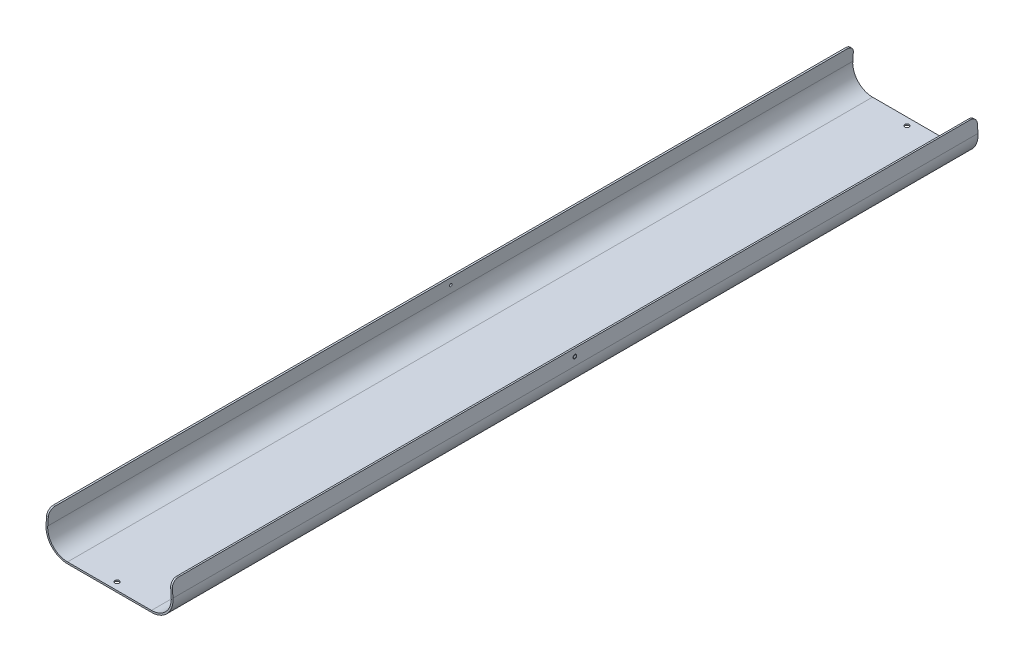
ISO-10303-21;
HEADER;
FILE_DESCRIPTION(('STEP AP214'),'2;1');
FILE_NAME('part.step','',(''),(''),'','','');
FILE_SCHEMA(('AUTOMOTIVE_DESIGN { 1 0 10303 214 1 1 1 1 }'));
ENDSEC;
DATA;
#1=APPLICATION_CONTEXT('core data for automotive mechanical design processes');
#2=APPLICATION_PROTOCOL_DEFINITION('international standard','automotive_design',2000,#1);
#3=PRODUCT_CONTEXT('',#1,'mechanical');
#4=PRODUCT('Part','Part','',(#3));
#5=PRODUCT_RELATED_PRODUCT_CATEGORY('part','',(#4));
#6=PRODUCT_DEFINITION_FORMATION('','',#4);
#7=PRODUCT_DEFINITION_CONTEXT('part definition',#1,'design');
#8=PRODUCT_DEFINITION('design','',#6,#7);
#9=PRODUCT_DEFINITION_SHAPE('','',#8);
#10=(LENGTH_UNIT() NAMED_UNIT(*) SI_UNIT(.MILLI.,.METRE.));
#11=(NAMED_UNIT(*) PLANE_ANGLE_UNIT() SI_UNIT($,.RADIAN.));
#12=(NAMED_UNIT(*) SI_UNIT($,.STERADIAN.) SOLID_ANGLE_UNIT());
#13=UNCERTAINTY_MEASURE_WITH_UNIT(LENGTH_MEASURE(1.E-05),#10,'distance_accuracy_value','');
#14=(GEOMETRIC_REPRESENTATION_CONTEXT(3) GLOBAL_UNCERTAINTY_ASSIGNED_CONTEXT((#13)) GLOBAL_UNIT_ASSIGNED_CONTEXT((#10,
#11,#12)) REPRESENTATION_CONTEXT('',''));
#15=CARTESIAN_POINT('',(0.,0.,0.));
#16=DIRECTION('',(0.,0.,1.));
#17=DIRECTION('',(1.,0.,0.));
#18=AXIS2_PLACEMENT_3D('',#15,#16,#17);
#19=CARTESIAN_POINT('',(534.973263073257,-183.689342682324,-133.95));
#20=DIRECTION('',(0.997564050259824,0.0697564737441253,0.));
#21=DIRECTION('',(-0.0697564737441253,0.997564050259824,0.));
#22=AXIS2_PLACEMENT_3D('',#19,#20,#21);
#23=CYLINDRICAL_SURFACE('',#22,1.25);
#24=CARTESIAN_POINT('',(533.377160592841,-183.800953040315,-133.95));
#25=DIRECTION('',(0.997564050259824,0.0697564737441253,0.));
#26=DIRECTION('',(-0.0697564737441253,0.997564050259824,0.));
#27=AXIS2_PLACEMENT_3D('',#24,#25,#26);
#28=CIRCLE('',#27,1.25);
#29=CARTESIAN_POINT('',(533.289965000661,-182.55399797749,-133.95));
#30=VERTEX_POINT('',#29);
#31=EDGE_CURVE('E264',#30,#30,#28,.F.);
#32=ORIENTED_EDGE('',*,*,#31,.T.);
#33=EDGE_LOOP('',(#32));
#34=FACE_BOUND('',#33,.T.);
#35=CARTESIAN_POINT('',(534.714088330439,-183.707465945825,-133.95));
#36=DIRECTION('',(0.997564050259825,0.0697564737441149,0.));
#37=DIRECTION('',(-0.0697564737440851,0.997564050259827,0.));
#38=AXIS2_PLACEMENT_3D('',#35,#36,#37);
#39=CIRCLE('',#38,1.24999999999625);
#40=CARTESIAN_POINT('',(534.62689273826,-182.460510883004,-133.95));
#41=VERTEX_POINT('',#40);
#42=EDGE_CURVE('E135',#41,#41,#39,.T.);
#43=ORIENTED_EDGE('',*,*,#42,.T.);
#44=EDGE_LOOP('',(#43));
#45=FACE_BOUND('',#44,.T.);
#46=ADVANCED_FACE('F16',(#34,#45),#23,.F.);
#47=CARTESIAN_POINT('',(418.043090655977,-183.76014596377,-133.95));
#48=DIRECTION('',(-0.997564050259822,0.069756473744153,0.));
#49=DIRECTION('',(-0.069756473744153,-0.997564050259822,0.));
#50=AXIS2_PLACEMENT_3D('',#47,#48,#49);
#51=CONICAL_SURFACE('',#50,1.6999999999747,1.04719755117636);
#52=CARTESIAN_POINT('',(418.043090656017,-183.760145963773,-133.95));
#53=DIRECTION('',(-0.997564050259822,0.069756473744153,0.));
#54=DIRECTION('',(-0.069756473744153,-0.997564050259822,0.));
#55=AXIS2_PLACEMENT_3D('',#52,#53,#54);
#56=CIRCLE('',#55,1.69999999990524);
#57=CARTESIAN_POINT('',(417.924504650659,-185.45600484912,-133.95));
#58=VERTEX_POINT('',#57);
#59=EDGE_CURVE('E261',#58,#58,#56,.F.);
#60=ORIENTED_EDGE('',*,*,#59,.F.);
#61=EDGE_LOOP('',(#60));
#62=FACE_BOUND('',#61,.T.);
#63=CARTESIAN_POINT('',(418.302265398848,-183.778269227275,-133.95));
#64=DIRECTION('',(-0.997564050259824,0.0697564737441253,0.));
#65=DIRECTION('',(-0.0697564737441253,-0.997564050259824,0.));
#66=AXIS2_PLACEMENT_3D('',#63,#64,#65);
#67=CIRCLE('',#66,1.25);
#68=CARTESIAN_POINT('',(418.215069806668,-185.0252242901,-133.95));
#69=VERTEX_POINT('',#68);
#70=EDGE_CURVE('E147',#69,#69,#67,.F.);
#71=ORIENTED_EDGE('',*,*,#70,.T.);
#72=EDGE_LOOP('',(#71));
#73=FACE_BOUND('',#72,.T.);
#74=ADVANCED_FACE('F539',(#62,#73),#51,.F.);
#75=CARTESIAN_POINT('',(534.973263073267,-183.689342682323,-133.95));
#76=DIRECTION('',(0.997564050259826,0.0697564737440966,0.));
#77=DIRECTION('',(-0.0697564737440966,0.997564050259826,0.));
#78=AXIS2_PLACEMENT_3D('',#75,#76,#77);
#79=CONICAL_SURFACE('',#78,1.70000000006523,1.04719755121284);
#80=CARTESIAN_POINT('',(534.973263073306,-183.68934268232,-133.95));
#81=DIRECTION('',(0.997564050259826,0.0697564737440966,0.));
#82=DIRECTION('',(-0.0697564737440966,0.997564050259826,0.));
#83=AXIS2_PLACEMENT_3D('',#80,#81,#82);
#84=CIRCLE('',#83,1.70000000013203);
#85=CARTESIAN_POINT('',(534.854677067932,-181.993483796747,-133.95));
#86=VERTEX_POINT('',#85);
#87=EDGE_CURVE('E184',#86,#86,#84,.F.);
#88=ORIENTED_EDGE('',*,*,#87,.F.);
#89=EDGE_LOOP('',(#88));
#90=FACE_BOUND('',#89,.T.);
#91=ORIENTED_EDGE('',*,*,#42,.F.);
#92=EDGE_LOOP('',(#91));
#93=FACE_BOUND('',#92,.T.);
#94=ADVANCED_FACE('F531',(#90,#93),#79,.F.);
#95=CARTESIAN_POINT('',(452.110985161686,-189.113817252795,-501.95));
#96=DIRECTION('',(-0.997564050259824,-0.0697564737441253,0.));
#97=DIRECTION('',(0.0697564737441253,-0.997564050259824,0.));
#98=AXIS2_PLACEMENT_3D('',#95,#96,#97);
#99=CYLINDRICAL_SURFACE('',#98,6.);
#100=DIRECTION('',(-0.997564050259824,-0.0697564737441253,0.));
#101=VECTOR('',#100,1.);
#102=CARTESIAN_POINT('',(452.110985161686,-189.113817252795,-507.95));
#103=LINE('',#102,#101);
#104=CARTESIAN_POINT('',(534.947528550506,-183.321321861195,-507.95));
#105=VERTEX_POINT('',#104);
#106=CARTESIAN_POINT('',(533.351426070091,-183.432932219185,-507.95));
#107=VERTEX_POINT('',#106);
#108=EDGE_CURVE('E125',#105,#107,#103,.T.);
#109=ORIENTED_EDGE('',*,*,#108,.T.);
#110=CARTESIAN_POINT('',(533.351426070091,-183.432932219185,-501.95));
#111=DIRECTION('',(-0.997564050259824,-0.0697564737441253,0.));
#112=DIRECTION('',(0.0697564737441253,-0.997564050259824,0.));
#113=AXIS2_PLACEMENT_3D('',#110,#111,#112);
#114=CIRCLE('',#113,6.);
#115=CARTESIAN_POINT('',(532.932887227626,-177.447547917626,-501.95));
#116=VERTEX_POINT('',#115);
#117=EDGE_CURVE('E19',#107,#116,#114,.F.);
#118=ORIENTED_EDGE('',*,*,#117,.T.);
#119=DIRECTION('',(-0.997564050259824,-0.0697564737441253,0.));
#120=VECTOR('',#119,1.);
#121=CARTESIAN_POINT('',(532.932887227626,-177.447547917626,-501.95));
#122=LINE('',#121,#120);
#123=CARTESIAN_POINT('',(534.528989708042,-177.335937559636,-501.95));
#124=VERTEX_POINT('',#123);
#125=EDGE_CURVE('E134',#124,#116,#122,.T.);
#126=ORIENTED_EDGE('',*,*,#125,.F.);
#127=CARTESIAN_POINT('',(534.947528550507,-183.321321861194,-501.95));
#128=DIRECTION('',(-0.997564050259824,-0.0697564737441253,0.));
#129=DIRECTION('',(0.0697564737441253,-0.997564050259824,0.));
#130=AXIS2_PLACEMENT_3D('',#127,#128,#129);
#131=CIRCLE('',#130,6.);
#132=EDGE_CURVE('E129',#105,#124,#131,.F.);
#133=ORIENTED_EDGE('',*,*,#132,.F.);
#134=EDGE_LOOP('',(#109,#118,#126,#133));
#135=FACE_BOUND('',#134,.T.);
#136=ADVANCED_FACE('F127',(#135),#99,.T.);
#137=CARTESIAN_POINT('',(532.932887227626,-177.447547917626,243.05));
#138=DIRECTION('',(-0.0697564737441253,0.997564050259824,0.));
#139=DIRECTION('',(-0.997564050259824,-0.0697564737441253,0.));
#140=AXIS2_PLACEMENT_3D('',#137,#138,#139);
#141=PLANE('',#140);
#142=DIRECTION('',(-0.997564050259824,-0.0697564737441253,0.));
#143=VECTOR('',#142,1.);
#144=CARTESIAN_POINT('',(451.692446319221,-183.128432951236,234.05));
#145=LINE('',#144,#143);
#146=CARTESIAN_POINT('',(534.528989708041,-177.335937559636,234.05));
#147=VERTEX_POINT('',#146);
#148=CARTESIAN_POINT('',(532.932887227626,-177.447547917626,234.05));
#149=VERTEX_POINT('',#148);
#150=EDGE_CURVE('E208',#147,#149,#145,.T.);
#151=ORIENTED_EDGE('',*,*,#150,.F.);
#152=DIRECTION('',(0.,0.,1.));
#153=VECTOR('',#152,1.);
#154=CARTESIAN_POINT('',(534.528989708041,-177.335937559636,-133.95));
#155=LINE('',#154,#153);
#156=EDGE_CURVE('E179',#124,#147,#155,.T.);
#157=ORIENTED_EDGE('',*,*,#156,.F.);
#158=ORIENTED_EDGE('',*,*,#125,.T.);
#159=DIRECTION('',(0.,0.,1.));
#160=VECTOR('',#159,1.);
#161=CARTESIAN_POINT('',(532.932887227626,-177.447547917626,-133.95));
#162=LINE('',#161,#160);
#163=EDGE_CURVE('E146',#116,#149,#162,.T.);
#164=ORIENTED_EDGE('',*,*,#163,.T.);
#165=EDGE_LOOP('',(#151,#157,#158,#164));
#166=FACE_BOUND('',#165,.T.);
#167=ADVANCED_FACE('F515',(#166),#141,.T.);
#168=CARTESIAN_POINT('',(452.110985161686,-189.113817252795,234.05));
#169=DIRECTION('',(-0.997564050259824,-0.0697564737441253,0.));
#170=DIRECTION('',(0.0697564737441253,-0.997564050259824,0.));
#171=AXIS2_PLACEMENT_3D('',#168,#169,#170);
#172=CYLINDRICAL_SURFACE('',#171,6.);
#173=ORIENTED_EDGE('',*,*,#150,.T.);
#174=CARTESIAN_POINT('',(533.351426070091,-183.432932219185,234.05));
#175=DIRECTION('',(-0.997564050259824,-0.0697564737441253,0.));
#176=DIRECTION('',(0.0697564737441253,-0.997564050259824,0.));
#177=AXIS2_PLACEMENT_3D('',#174,#175,#176);
#178=CIRCLE('',#177,6.);
#179=CARTESIAN_POINT('',(533.351426070091,-183.432932219185,240.05));
#180=VERTEX_POINT('',#179);
#181=EDGE_CURVE('E199',#149,#180,#178,.F.);
#182=ORIENTED_EDGE('',*,*,#181,.T.);
#183=DIRECTION('',(-0.997564050259824,-0.0697564737441253,0.));
#184=VECTOR('',#183,1.);
#185=CARTESIAN_POINT('',(452.110985161686,-189.113817252795,240.05));
#186=LINE('',#185,#184);
#187=CARTESIAN_POINT('',(534.947528550506,-183.321321861194,240.05));
#188=VERTEX_POINT('',#187);
#189=EDGE_CURVE('E209',#180,#188,#186,.F.);
#190=ORIENTED_EDGE('',*,*,#189,.T.);
#191=CARTESIAN_POINT('',(534.947528550506,-183.321321861195,234.05));
#192=DIRECTION('',(-0.997564050259824,-0.0697564737441253,0.));
#193=DIRECTION('',(0.0697564737441253,-0.997564050259824,0.));
#194=AXIS2_PLACEMENT_3D('',#191,#192,#193);
#195=CIRCLE('',#194,6.);
#196=EDGE_CURVE('E181',#147,#188,#195,.F.);
#197=ORIENTED_EDGE('',*,*,#196,.F.);
#198=EDGE_LOOP('',(#173,#182,#190,#197));
#199=FACE_BOUND('',#198,.T.);
#200=ADVANCED_FACE('F268',(#199),#172,.T.);
#201=CARTESIAN_POINT('',(452.110985161686,-185.701435369486,234.05));
#202=DIRECTION('',(0.997564050259824,-0.0697564737441253,0.));
#203=DIRECTION('',(0.0697564737441253,0.997564050259824,0.));
#204=AXIS2_PLACEMENT_3D('',#201,#202,#203);
#205=CYLINDRICAL_SURFACE('',#204,6.);
#206=DIRECTION('',(0.997564050259824,-0.0697564737441253,0.));
#207=VECTOR('',#206,1.);
#208=CARTESIAN_POINT('',(452.110985161686,-185.701435369487,240.05));
#209=LINE('',#208,#207);
#210=CARTESIAN_POINT('',(418.073776226517,-183.321321861195,240.05));
#211=VERTEX_POINT('',#210);
#212=CARTESIAN_POINT('',(419.669878706933,-183.432932219185,240.05));
#213=VERTEX_POINT('',#212);
#214=EDGE_CURVE('E206',#211,#213,#209,.T.);
#215=ORIENTED_EDGE('',*,*,#214,.T.);
#216=CARTESIAN_POINT('',(419.669878706933,-183.432932219185,234.05));
#217=DIRECTION('',(0.997564050259824,-0.0697564737441253,0.));
#218=DIRECTION('',(0.0697564737441253,0.997564050259824,0.));
#219=AXIS2_PLACEMENT_3D('',#216,#217,#218);
#220=CIRCLE('',#219,6.);
#221=CARTESIAN_POINT('',(420.088417549397,-177.447547917626,234.05));
#222=VERTEX_POINT('',#221);
#223=EDGE_CURVE('E178',#213,#222,#220,.F.);
#224=ORIENTED_EDGE('',*,*,#223,.T.);
#225=DIRECTION('',(-0.997564050259824,0.0697564737441253,0.));
#226=VECTOR('',#225,1.);
#227=CARTESIAN_POINT('',(420.088417549397,-177.447547917626,234.05));
#228=LINE('',#227,#226);
#229=CARTESIAN_POINT('',(418.492315068982,-177.335937559636,234.05));
#230=VERTEX_POINT('',#229);
#231=EDGE_CURVE('E204',#230,#222,#228,.F.);
#232=ORIENTED_EDGE('',*,*,#231,.F.);
#233=CARTESIAN_POINT('',(418.073776226517,-183.321321861195,234.05));
#234=DIRECTION('',(0.997564050259824,-0.0697564737441253,0.));
#235=DIRECTION('',(0.0697564737441253,0.997564050259824,0.));
#236=AXIS2_PLACEMENT_3D('',#233,#234,#235);
#237=CIRCLE('',#236,6.);
#238=EDGE_CURVE('E194',#211,#230,#237,.F.);
#239=ORIENTED_EDGE('',*,*,#238,.F.);
#240=EDGE_LOOP('',(#215,#224,#232,#239));
#241=FACE_BOUND('',#240,.T.);
#242=ADVANCED_FACE('F498',(#241),#205,.T.);
#243=CARTESIAN_POINT('',(420.088417549397,-177.447547917626,-510.95));
#244=DIRECTION('',(0.0697564737441253,0.997564050259824,0.));
#245=DIRECTION('',(-0.997564050259824,0.0697564737441253,0.));
#246=AXIS2_PLACEMENT_3D('',#243,#244,#245);
#247=PLANE('',#246);
#248=DIRECTION('',(0.997564050259824,-0.0697564737441253,0.));
#249=VECTOR('',#248,1.);
#250=CARTESIAN_POINT('',(452.529524004151,-179.716051067927,-501.95));
#251=LINE('',#250,#249);
#252=CARTESIAN_POINT('',(418.492315068982,-177.335937559636,-501.95));
#253=VERTEX_POINT('',#252);
#254=CARTESIAN_POINT('',(420.088417549397,-177.447547917626,-501.95));
#255=VERTEX_POINT('',#254);
#256=EDGE_CURVE('E200',#253,#255,#251,.T.);
#257=ORIENTED_EDGE('',*,*,#256,.F.);
#258=DIRECTION('',(0.,0.,1.));
#259=VECTOR('',#258,1.);
#260=CARTESIAN_POINT('',(418.492315068982,-177.335937559636,-133.95));
#261=LINE('',#260,#259);
#262=EDGE_CURVE('E192',#230,#253,#261,.F.);
#263=ORIENTED_EDGE('',*,*,#262,.F.);
#264=ORIENTED_EDGE('',*,*,#231,.T.);
#265=DIRECTION('',(0.,0.,1.));
#266=VECTOR('',#265,1.);
#267=CARTESIAN_POINT('',(420.088417549397,-177.447547917626,-133.95));
#268=LINE('',#267,#266);
#269=EDGE_CURVE('E174',#222,#255,#268,.F.);
#270=ORIENTED_EDGE('',*,*,#269,.T.);
#271=EDGE_LOOP('',(#257,#263,#264,#270));
#272=FACE_BOUND('',#271,.T.);
#273=ADVANCED_FACE('F490',(#272),#247,.T.);
#274=CARTESIAN_POINT('',(452.110985161686,-185.701435369486,-501.95));
#275=DIRECTION('',(0.997564050259824,-0.0697564737441253,0.));
#276=DIRECTION('',(0.0697564737441253,0.997564050259824,0.));
#277=AXIS2_PLACEMENT_3D('',#274,#275,#276);
#278=CYLINDRICAL_SURFACE('',#277,6.);
#279=ORIENTED_EDGE('',*,*,#256,.T.);
#280=CARTESIAN_POINT('',(419.669878706932,-183.432932219185,-501.95));
#281=DIRECTION('',(0.997564050259824,-0.0697564737441253,0.));
#282=DIRECTION('',(0.0697564737441253,0.997564050259824,0.));
#283=AXIS2_PLACEMENT_3D('',#280,#281,#282);
#284=CIRCLE('',#283,6.);
#285=CARTESIAN_POINT('',(419.669878706933,-183.432932219185,-507.95));
#286=VERTEX_POINT('',#285);
#287=EDGE_CURVE('E177',#255,#286,#284,.F.);
#288=ORIENTED_EDGE('',*,*,#287,.T.);
#289=DIRECTION('',(0.997564050259824,-0.0697564737441253,0.));
#290=VECTOR('',#289,1.);
#291=CARTESIAN_POINT('',(452.110985161686,-185.701435369486,-507.95));
#292=LINE('',#291,#290);
#293=CARTESIAN_POINT('',(418.073776226517,-183.321321861194,-507.95));
#294=VERTEX_POINT('',#293);
#295=EDGE_CURVE('E202',#286,#294,#292,.F.);
#296=ORIENTED_EDGE('',*,*,#295,.T.);
#297=CARTESIAN_POINT('',(418.073776226517,-183.321321861194,-501.95));
#298=DIRECTION('',(0.997564050259824,-0.0697564737441253,0.));
#299=DIRECTION('',(0.0697564737441253,0.997564050259824,0.));
#300=AXIS2_PLACEMENT_3D('',#297,#298,#299);
#301=CIRCLE('',#300,6.);
#302=EDGE_CURVE('E191',#253,#294,#301,.F.);
#303=ORIENTED_EDGE('',*,*,#302,.F.);
#304=EDGE_LOOP('',(#279,#288,#296,#303));
#305=FACE_BOUND('',#304,.T.);
#306=ADVANCED_FACE('F308',(#305),#278,.T.);
#307=CARTESIAN_POINT('',(418.04309065602,-183.760145963773,-133.95));
#308=DIRECTION('',(-0.997564050259824,0.0697564737441253,0.));
#309=DIRECTION('',(-0.0697564737441253,-0.997564050259824,0.));
#310=AXIS2_PLACEMENT_3D('',#307,#308,#309);
#311=CYLINDRICAL_SURFACE('',#310,1.25);
#312=CARTESIAN_POINT('',(419.639193136435,-183.871756321764,-133.95));
#313=DIRECTION('',(-0.997564050259824,0.0697564737441253,0.));
#314=DIRECTION('',(-0.0697564737441253,-0.997564050259824,0.));
#315=AXIS2_PLACEMENT_3D('',#312,#313,#314);
#316=CIRCLE('',#315,1.25);
#317=CARTESIAN_POINT('',(419.551997544255,-185.118711384588,-133.95));
#318=VERTEX_POINT('',#317);
#319=EDGE_CURVE('E246',#318,#318,#316,.F.);
#320=ORIENTED_EDGE('',*,*,#319,.T.);
#321=EDGE_LOOP('',(#320));
#322=FACE_BOUND('',#321,.T.);
#323=ORIENTED_EDGE('',*,*,#70,.F.);
#324=EDGE_LOOP('',(#323));
#325=FACE_BOUND('',#324,.T.);
#326=ADVANCED_FACE('F472',(#322,#325),#311,.F.);
#327=CARTESIAN_POINT('',(541.151051633401,-294.972774327403,-133.95));
#328=DIRECTION('',(0.997564050259824,0.0697564737441253,0.));
#329=DIRECTION('',(-0.0697564737441253,0.997564050259824,0.));
#330=AXIS2_PLACEMENT_3D('',#327,#328,#329);
#331=PLANE('',#330);
#332=ORIENTED_EDGE('',*,*,#31,.F.);
#333=EDGE_LOOP('',(#332));
#334=FACE_BOUND('',#333,.T.);
#335=DIRECTION('',(0.0697564737440897,-0.997564050259827,0.));
#336=VECTOR('',#335,1.);
#337=CARTESIAN_POINT('',(533.351426070091,-183.432932219185,240.05));
#338=LINE('',#337,#336);
#339=CARTESIAN_POINT('',(533.880955302983,-191.005553051951,240.05));
#340=VERTEX_POINT('',#339);
#341=EDGE_CURVE('E197',#180,#340,#338,.T.);
#342=ORIENTED_EDGE('',*,*,#341,.F.);
#343=ORIENTED_EDGE('',*,*,#181,.F.);
#344=ORIENTED_EDGE('',*,*,#163,.F.);
#345=ORIENTED_EDGE('',*,*,#117,.F.);
#346=DIRECTION('',(-0.0697564737440897,0.997564050259827,0.));
#347=VECTOR('',#346,1.);
#348=CARTESIAN_POINT('',(533.880955302983,-191.005553051951,-507.95));
#349=LINE('',#348,#347);
#350=CARTESIAN_POINT('',(533.880955302983,-191.005553051951,-507.95));
#351=VERTEX_POINT('',#350);
#352=EDGE_CURVE('E142',#351,#107,#349,.T.);
#353=ORIENTED_EDGE('',*,*,#352,.F.);
#354=DIRECTION('',(0.,0.,-1.));
#355=VECTOR('',#354,1.);
#356=CARTESIAN_POINT('',(533.880955302983,-191.005553051951,-133.95));
#357=LINE('',#356,#355);
#358=EDGE_CURVE('E195',#351,#340,#357,.F.);
#359=ORIENTED_EDGE('',*,*,#358,.T.);
#360=EDGE_LOOP('',(#342,#343,#344,#345,#353,#359));
#361=FACE_BOUND('',#360,.T.);
#362=ADVANCED_FACE('F140',(#334,#361),#331,.F.);
#363=CARTESIAN_POINT('',(414.27904726792,-237.588474232773,-133.95));
#364=DIRECTION('',(-0.997564050259824,0.0697564737441253,0.));
#365=DIRECTION('',(-0.0697564737441253,-0.997564050259824,0.));
#366=AXIS2_PLACEMENT_3D('',#363,#364,#365);
#367=PLANE('',#366);
#368=ORIENTED_EDGE('',*,*,#302,.T.);
#369=DIRECTION('',(0.0697564737440846,0.997564050259827,0.));
#370=VECTOR('',#369,1.);
#371=CARTESIAN_POINT('',(417.544246993625,-190.89394269396,-507.95));
#372=LINE('',#371,#370);
#373=CARTESIAN_POINT('',(417.544246993625,-190.893942693961,-507.95));
#374=VERTEX_POINT('',#373);
#375=EDGE_CURVE('E235',#374,#294,#372,.T.);
#376=ORIENTED_EDGE('',*,*,#375,.F.);
#377=DIRECTION('',(0.,0.,-1.));
#378=VECTOR('',#377,1.);
#379=CARTESIAN_POINT('',(417.544246993625,-190.89394269396,-133.95));
#380=LINE('',#379,#378);
#381=CARTESIAN_POINT('',(417.544246993625,-190.893942693961,240.05));
#382=VERTEX_POINT('',#381);
#383=EDGE_CURVE('E189',#382,#374,#380,.T.);
#384=ORIENTED_EDGE('',*,*,#383,.F.);
#385=DIRECTION('',(-0.0697564737440846,-0.997564050259827,0.));
#386=VECTOR('',#385,1.);
#387=CARTESIAN_POINT('',(418.073776226517,-183.321321861195,240.05));
#388=LINE('',#387,#386);
#389=EDGE_CURVE('E230',#211,#382,#388,.T.);
#390=ORIENTED_EDGE('',*,*,#389,.F.);
#391=ORIENTED_EDGE('',*,*,#238,.T.);
#392=ORIENTED_EDGE('',*,*,#262,.T.);
#393=EDGE_LOOP('',(#368,#376,#384,#390,#391,#392));
#394=FACE_BOUND('',#393,.T.);
#395=ORIENTED_EDGE('',*,*,#59,.T.);
#396=EDGE_LOOP('',(#395));
#397=FACE_BOUND('',#396,.T.);
#398=ADVANCED_FACE('F301',(#394,#397),#367,.T.);
#399=CARTESIAN_POINT('',(437.495527998821,-192.289072168843,-133.95));
#400=DIRECTION('',(0.,0.,-1.));
#401=DIRECTION('',(-1.,0.,0.));
#402=AXIS2_PLACEMENT_3D('',#399,#400,#401);
#403=CYLINDRICAL_SURFACE('',#402,20.);
#404=ORIENTED_EDGE('',*,*,#383,.T.);
#405=CARTESIAN_POINT('',(437.495527998821,-192.289072168843,-507.95));
#406=DIRECTION('',(0.,0.,-1.));
#407=DIRECTION('',(-1.,0.,0.));
#408=AXIS2_PLACEMENT_3D('',#405,#406,#407);
#409=CIRCLE('',#408,20.);
#410=CARTESIAN_POINT('',(437.495527998821,-212.289072168843,-507.95));
#411=VERTEX_POINT('',#410);
#412=EDGE_CURVE('E236',#411,#374,#409,.T.);
#413=ORIENTED_EDGE('',*,*,#412,.F.);
#414=DIRECTION('',(0.,0.,-1.));
#415=VECTOR('',#414,1.);
#416=CARTESIAN_POINT('',(437.495527998821,-212.289072168843,-133.95));
#417=LINE('',#416,#415);
#418=CARTESIAN_POINT('',(437.495527998821,-212.289072168843,240.05));
#419=VERTEX_POINT('',#418);
#420=EDGE_CURVE('E187',#419,#411,#417,.T.);
#421=ORIENTED_EDGE('',*,*,#420,.F.);
#422=CARTESIAN_POINT('',(437.495527998821,-192.289072168843,240.05));
#423=DIRECTION('',(0.,0.,-1.));
#424=DIRECTION('',(-1.,0.,0.));
#425=AXIS2_PLACEMENT_3D('',#422,#423,#424);
#426=CIRCLE('',#425,20.);
#427=EDGE_CURVE('E228',#382,#419,#426,.F.);
#428=ORIENTED_EDGE('',*,*,#427,.F.);
#429=EDGE_LOOP('',(#404,#413,#421,#428));
#430=FACE_BOUND('',#429,.T.);
#431=ADVANCED_FACE('F295',(#430),#403,.T.);
#432=CARTESIAN_POINT('',(447.804380484607,-212.289072168843,-133.95));
#433=DIRECTION('',(0.,-1.,0.));
#434=DIRECTION('',(0.,0.,-1.));
#435=AXIS2_PLACEMENT_3D('',#432,#433,#434);
#436=PLANE('',#435);
#437=DIRECTION('',(0.,0.,-1.));
#438=VECTOR('',#437,1.);
#439=CARTESIAN_POINT('',(515.525776778202,-212.289072168843,-133.95));
#440=LINE('',#439,#438);
#441=CARTESIAN_POINT('',(515.525776778202,-212.289072168843,240.05));
#442=VERTEX_POINT('',#441);
#443=CARTESIAN_POINT('',(515.525776778202,-212.289072168843,-507.95));
#444=VERTEX_POINT('',#443);
#445=EDGE_CURVE('E185',#442,#444,#440,.T.);
#446=ORIENTED_EDGE('',*,*,#445,.F.);
#447=DIRECTION('',(1.,0.,0.));
#448=VECTOR('',#447,1.);
#449=CARTESIAN_POINT('',(550.030341904479,-212.289072168843,240.05));
#450=LINE('',#449,#448);
#451=EDGE_CURVE('E227',#419,#442,#450,.T.);
#452=ORIENTED_EDGE('',*,*,#451,.F.);
#453=ORIENTED_EDGE('',*,*,#420,.T.);
#454=DIRECTION('',(-1.,0.,0.));
#455=VECTOR('',#454,1.);
#456=CARTESIAN_POINT('',(542.79405339825,-212.289072168843,-507.95));
#457=LINE('',#456,#455);
#458=EDGE_CURVE('E238',#444,#411,#457,.T.);
#459=ORIENTED_EDGE('',*,*,#458,.F.);
#460=EDGE_LOOP('',(#446,#452,#453,#459));
#461=FACE_BOUND('',#460,.T.);
#462=CARTESIAN_POINT('',(476.510652388512,-212.289072168882,233.019999963041));
#463=DIRECTION('',(0.,-1.,0.));
#464=DIRECTION('',(0.,0.,-1.));
#465=AXIS2_PLACEMENT_3D('',#462,#463,#464);
#466=CIRCLE('',#465,2.8600000000128);
#467=CARTESIAN_POINT('',(476.510652388512,-212.289072168882,230.159999963028));
#468=VERTEX_POINT('',#467);
#469=EDGE_CURVE('E243',#468,#468,#466,.F.);
#470=ORIENTED_EDGE('',*,*,#469,.T.);
#471=EDGE_LOOP('',(#470));
#472=FACE_BOUND('',#471,.T.);
#473=CARTESIAN_POINT('',(476.510652388512,-212.289072168882,-500.919999963041));
#474=DIRECTION('',(0.,-1.,0.));
#475=DIRECTION('',(0.,0.,-1.));
#476=AXIS2_PLACEMENT_3D('',#473,#474,#475);
#477=CIRCLE('',#476,2.8600000000128);
#478=CARTESIAN_POINT('',(476.510652388512,-212.289072168882,-503.779999963054));
#479=VERTEX_POINT('',#478);
#480=EDGE_CURVE('E159',#479,#479,#477,.F.);
#481=ORIENTED_EDGE('',*,*,#480,.T.);
#482=EDGE_LOOP('',(#481));
#483=FACE_BOUND('',#482,.T.);
#484=ADVANCED_FACE('F442',(#461,#472,#483),#436,.T.);
#485=CARTESIAN_POINT('',(515.525776778202,-192.289072168843,-133.95));
#486=DIRECTION('',(0.,0.,-1.));
#487=DIRECTION('',(-1.,0.,0.));
#488=AXIS2_PLACEMENT_3D('',#485,#486,#487);
#489=CYLINDRICAL_SURFACE('',#488,20.);
#490=ORIENTED_EDGE('',*,*,#445,.T.);
#491=CARTESIAN_POINT('',(515.525776778202,-192.289072168843,-507.95));
#492=DIRECTION('',(0.,0.,-1.));
#493=DIRECTION('',(-1.,0.,0.));
#494=AXIS2_PLACEMENT_3D('',#491,#492,#493);
#495=CIRCLE('',#494,20.);
#496=CARTESIAN_POINT('',(535.477057783398,-190.893942693959,-507.95));
#497=VERTEX_POINT('',#496);
#498=EDGE_CURVE('E156',#497,#444,#495,.T.);
#499=ORIENTED_EDGE('',*,*,#498,.F.);
#500=DIRECTION('',(0.,0.,1.));
#501=VECTOR('',#500,1.);
#502=CARTESIAN_POINT('',(535.477057783398,-190.89394269396,-133.95));
#503=LINE('',#502,#501);
#504=CARTESIAN_POINT('',(535.477057783398,-190.893942693959,240.05));
#505=VERTEX_POINT('',#504);
#506=EDGE_CURVE('E182',#505,#497,#503,.F.);
#507=ORIENTED_EDGE('',*,*,#506,.F.);
#508=CARTESIAN_POINT('',(515.525776778202,-192.289072168843,240.05));
#509=DIRECTION('',(0.,0.,-1.));
#510=DIRECTION('',(-1.,0.,0.));
#511=AXIS2_PLACEMENT_3D('',#508,#509,#510);
#512=CIRCLE('',#511,20.);
#513=EDGE_CURVE('E225',#442,#505,#512,.F.);
#514=ORIENTED_EDGE('',*,*,#513,.F.);
#515=EDGE_LOOP('',(#490,#499,#507,#514));
#516=FACE_BOUND('',#515,.T.);
#517=ADVANCED_FACE('F433',(#516),#489,.T.);
#518=CARTESIAN_POINT('',(542.747154113816,-294.861163969412,-133.95));
#519=DIRECTION('',(0.997564050259824,0.0697564737441253,0.));
#520=DIRECTION('',(-0.0697564737441253,0.997564050259824,0.));
#521=AXIS2_PLACEMENT_3D('',#518,#519,#520);
#522=PLANE('',#521);
#523=ORIENTED_EDGE('',*,*,#196,.T.);
#524=DIRECTION('',(-0.0697564737442155,0.997564050259818,0.));
#525=VECTOR('',#524,1.);
#526=CARTESIAN_POINT('',(535.477057783399,-190.89394269396,240.05));
#527=LINE('',#526,#525);
#528=EDGE_CURVE('E224',#505,#188,#527,.T.);
#529=ORIENTED_EDGE('',*,*,#528,.F.);
#530=ORIENTED_EDGE('',*,*,#506,.T.);
#531=DIRECTION('',(0.0697564737442155,-0.997564050259818,0.));
#532=VECTOR('',#531,1.);
#533=CARTESIAN_POINT('',(534.947528550506,-183.321321861195,-507.95));
#534=LINE('',#533,#532);
#535=EDGE_CURVE('E153',#105,#497,#534,.T.);
#536=ORIENTED_EDGE('',*,*,#535,.F.);
#537=ORIENTED_EDGE('',*,*,#132,.T.);
#538=ORIENTED_EDGE('',*,*,#156,.T.);
#539=EDGE_LOOP('',(#523,#529,#530,#536,#537,#538));
#540=FACE_BOUND('',#539,.T.);
#541=ORIENTED_EDGE('',*,*,#87,.T.);
#542=EDGE_LOOP('',(#541));
#543=FACE_BOUND('',#542,.T.);
#544=ADVANCED_FACE('F424',(#540,#543),#522,.T.);
#545=CARTESIAN_POINT('',(415.875149748335,-237.700084590764,-133.95));
#546=DIRECTION('',(-0.997564050259824,0.0697564737441253,0.));
#547=DIRECTION('',(-0.0697564737441253,-0.997564050259824,0.));
#548=AXIS2_PLACEMENT_3D('',#545,#546,#547);
#549=PLANE('',#548);
#550=ORIENTED_EDGE('',*,*,#319,.F.);
#551=EDGE_LOOP('',(#550));
#552=FACE_BOUND('',#551,.T.);
#553=DIRECTION('',(-0.0697564737442061,-0.997564050259819,0.));
#554=VECTOR('',#553,1.);
#555=CARTESIAN_POINT('',(419.669878706933,-183.432932219185,-507.95));
#556=LINE('',#555,#554);
#557=CARTESIAN_POINT('',(419.14034947404,-191.00555305195,-507.95));
#558=VERTEX_POINT('',#557);
#559=EDGE_CURVE('E154',#286,#558,#556,.T.);
#560=ORIENTED_EDGE('',*,*,#559,.F.);
#561=ORIENTED_EDGE('',*,*,#287,.F.);
#562=ORIENTED_EDGE('',*,*,#269,.F.);
#563=ORIENTED_EDGE('',*,*,#223,.F.);
#564=DIRECTION('',(0.0697564737442061,0.997564050259819,0.));
#565=VECTOR('',#564,1.);
#566=CARTESIAN_POINT('',(419.14034947404,-191.005553051951,240.05));
#567=LINE('',#566,#565);
#568=CARTESIAN_POINT('',(419.14034947404,-191.00555305195,240.05));
#569=VERTEX_POINT('',#568);
#570=EDGE_CURVE('E233',#569,#213,#567,.T.);
#571=ORIENTED_EDGE('',*,*,#570,.F.);
#572=DIRECTION('',(0.,0.,-1.));
#573=VECTOR('',#572,1.);
#574=CARTESIAN_POINT('',(419.14034947404,-191.005553051951,-133.95));
#575=LINE('',#574,#573);
#576=EDGE_CURVE('E171',#569,#558,#575,.T.);
#577=ORIENTED_EDGE('',*,*,#576,.T.);
#578=EDGE_LOOP('',(#560,#561,#562,#563,#571,#577));
#579=FACE_BOUND('',#578,.T.);
#580=ADVANCED_FACE('F312',(#552,#579),#549,.F.);
#581=CARTESIAN_POINT('',(476.510652388512,-212.289072168915,233.019999963041));
#582=DIRECTION('',(0.,-1.,0.));
#583=DIRECTION('',(0.,0.,-1.));
#584=AXIS2_PLACEMENT_3D('',#581,#582,#583);
#585=CONICAL_SURFACE('',#584,2.86000000006964,1.04719755116771);
#586=ORIENTED_EDGE('',*,*,#469,.F.);
#587=EDGE_LOOP('',(#586));
#588=FACE_BOUND('',#587,.T.);
#589=CARTESIAN_POINT('',(476.510652388512,-211.850285964258,233.019999963041));
#590=DIRECTION('',(0.,-1.,0.));
#591=DIRECTION('',(0.,0.,-1.));
#592=AXIS2_PLACEMENT_3D('',#589,#590,#591);
#593=CIRCLE('',#592,2.1);
#594=CARTESIAN_POINT('',(476.510652388512,-211.850285964258,230.919999963041));
#595=VERTEX_POINT('',#594);
#596=EDGE_CURVE('E167',#595,#595,#593,.F.);
#597=ORIENTED_EDGE('',*,*,#596,.T.);
#598=EDGE_LOOP('',(#597));
#599=FACE_BOUND('',#598,.T.);
#600=ADVANCED_FACE('F407',(#588,#599),#585,.F.);
#601=CARTESIAN_POINT('',(476.510652388512,-212.289072168915,-500.919999963041));
#602=DIRECTION('',(0.,-1.,0.));
#603=DIRECTION('',(0.,0.,-1.));
#604=AXIS2_PLACEMENT_3D('',#601,#602,#603);
#605=CONICAL_SURFACE('',#604,2.86000000006964,1.04719755116771);
#606=ORIENTED_EDGE('',*,*,#480,.F.);
#607=EDGE_LOOP('',(#606));
#608=FACE_BOUND('',#607,.T.);
#609=CARTESIAN_POINT('',(476.510652388512,-211.850285964258,-500.919999963041));
#610=DIRECTION('',(0.,-1.,0.));
#611=DIRECTION('',(0.,0.,-1.));
#612=AXIS2_PLACEMENT_3D('',#609,#610,#611);
#613=CIRCLE('',#612,2.1);
#614=CARTESIAN_POINT('',(476.510652388512,-211.850285964258,-503.019999963041));
#615=VERTEX_POINT('',#614);
#616=EDGE_CURVE('E163',#615,#615,#613,.F.);
#617=ORIENTED_EDGE('',*,*,#616,.T.);
#618=EDGE_LOOP('',(#617));
#619=FACE_BOUND('',#618,.T.);
#620=ADVANCED_FACE('F332',(#608,#619),#605,.F.);
#621=CARTESIAN_POINT('',(542.79405339825,-224.028523700214,-507.95));
#622=DIRECTION('',(0.,0.,-1.));
#623=DIRECTION('',(-1.,0.,0.));
#624=AXIS2_PLACEMENT_3D('',#621,#622,#623);
#625=PLANE('',#624);
#626=ORIENTED_EDGE('',*,*,#412,.T.);
#627=ORIENTED_EDGE('',*,*,#375,.T.);
#628=ORIENTED_EDGE('',*,*,#295,.F.);
#629=ORIENTED_EDGE('',*,*,#559,.T.);
#630=CARTESIAN_POINT('',(437.495527998821,-192.289072168843,-507.95));
#631=DIRECTION('',(0.,0.,-1.));
#632=DIRECTION('',(-1.,0.,0.));
#633=AXIS2_PLACEMENT_3D('',#630,#631,#632);
#634=CIRCLE('',#633,18.4);
#635=CARTESIAN_POINT('',(437.495527998821,-210.689072168843,-507.95));
#636=VERTEX_POINT('',#635);
#637=EDGE_CURVE('E170',#558,#636,#634,.F.);
#638=ORIENTED_EDGE('',*,*,#637,.T.);
#639=DIRECTION('',(1.,0.,0.));
#640=VECTOR('',#639,1.);
#641=CARTESIAN_POINT('',(447.804380484607,-210.689072168843,-507.95));
#642=LINE('',#641,#640);
#643=CARTESIAN_POINT('',(515.525776778202,-210.689072168843,-507.95));
#644=VERTEX_POINT('',#643);
#645=EDGE_CURVE('E166',#636,#644,#642,.T.);
#646=ORIENTED_EDGE('',*,*,#645,.T.);
#647=CARTESIAN_POINT('',(515.525776778202,-192.289072168843,-507.95));
#648=DIRECTION('',(0.,0.,-1.));
#649=DIRECTION('',(-1.,0.,0.));
#650=AXIS2_PLACEMENT_3D('',#647,#648,#649);
#651=CIRCLE('',#650,18.4);
#652=EDGE_CURVE('E152',#644,#351,#651,.F.);
#653=ORIENTED_EDGE('',*,*,#652,.T.);
#654=ORIENTED_EDGE('',*,*,#352,.T.);
#655=ORIENTED_EDGE('',*,*,#108,.F.);
#656=ORIENTED_EDGE('',*,*,#535,.T.);
#657=ORIENTED_EDGE('',*,*,#498,.T.);
#658=ORIENTED_EDGE('',*,*,#458,.T.);
#659=EDGE_LOOP('',(#626,#627,#628,#629,#638,#646,#653,#654,#655,#656,#657,#658));
#660=FACE_BOUND('',#659,.T.);
#661=ADVANCED_FACE('F150',(#660),#625,.T.);
#662=CARTESIAN_POINT('',(515.525776778202,-192.289072168843,-133.95));
#663=DIRECTION('',(0.,0.,-1.));
#664=DIRECTION('',(-1.,0.,0.));
#665=AXIS2_PLACEMENT_3D('',#662,#663,#664);
#666=CYLINDRICAL_SURFACE('',#665,18.4);
#667=ORIENTED_EDGE('',*,*,#652,.F.);
#668=DIRECTION('',(0.,0.,-1.));
#669=VECTOR('',#668,1.);
#670=CARTESIAN_POINT('',(515.525776778202,-210.689072168843,-133.95));
#671=LINE('',#670,#669);
#672=CARTESIAN_POINT('',(515.525776778202,-210.689072168843,240.05));
#673=VERTEX_POINT('',#672);
#674=EDGE_CURVE('E277',#644,#673,#671,.F.);
#675=ORIENTED_EDGE('',*,*,#674,.T.);
#676=CARTESIAN_POINT('',(515.525776778202,-192.289072168843,240.05));
#677=DIRECTION('',(0.,0.,-1.));
#678=DIRECTION('',(-1.,0.,0.));
#679=AXIS2_PLACEMENT_3D('',#676,#677,#678);
#680=CIRCLE('',#679,18.4);
#681=EDGE_CURVE('E231',#340,#673,#680,.T.);
#682=ORIENTED_EDGE('',*,*,#681,.F.);
#683=ORIENTED_EDGE('',*,*,#358,.F.);
#684=EDGE_LOOP('',(#667,#675,#682,#683));
#685=FACE_BOUND('',#684,.T.);
#686=ADVANCED_FACE('F323',(#685),#666,.F.);
#687=CARTESIAN_POINT('',(550.030341904479,-400.5015417055,240.05));
#688=DIRECTION('',(0.,0.,1.));
#689=DIRECTION('',(1.,0.,0.));
#690=AXIS2_PLACEMENT_3D('',#687,#688,#689);
#691=PLANE('',#690);
#692=ORIENTED_EDGE('',*,*,#513,.T.);
#693=ORIENTED_EDGE('',*,*,#528,.T.);
#694=ORIENTED_EDGE('',*,*,#189,.F.);
#695=ORIENTED_EDGE('',*,*,#341,.T.);
#696=ORIENTED_EDGE('',*,*,#681,.T.);
#697=DIRECTION('',(1.,0.,0.));
#698=VECTOR('',#697,1.);
#699=CARTESIAN_POINT('',(447.804380484607,-210.689072168843,240.05));
#700=LINE('',#699,#698);
#701=CARTESIAN_POINT('',(437.495527998821,-210.689072168843,240.05));
#702=VERTEX_POINT('',#701);
#703=EDGE_CURVE('E280',#673,#702,#700,.F.);
#704=ORIENTED_EDGE('',*,*,#703,.T.);
#705=CARTESIAN_POINT('',(437.495527998821,-192.289072168843,240.05));
#706=DIRECTION('',(0.,0.,-1.));
#707=DIRECTION('',(-1.,0.,0.));
#708=AXIS2_PLACEMENT_3D('',#705,#706,#707);
#709=CIRCLE('',#708,18.4);
#710=EDGE_CURVE('E34',#702,#569,#709,.T.);
#711=ORIENTED_EDGE('',*,*,#710,.T.);
#712=ORIENTED_EDGE('',*,*,#570,.T.);
#713=ORIENTED_EDGE('',*,*,#214,.F.);
#714=ORIENTED_EDGE('',*,*,#389,.T.);
#715=ORIENTED_EDGE('',*,*,#427,.T.);
#716=ORIENTED_EDGE('',*,*,#451,.T.);
#717=EDGE_LOOP('',(#692,#693,#694,#695,#696,#704,#711,#712,#713,#714,#715,#716));
#718=FACE_BOUND('',#717,.T.);
#719=ADVANCED_FACE('F316',(#718),#691,.T.);
#720=CARTESIAN_POINT('',(437.495527998821,-192.289072168843,-133.95));
#721=DIRECTION('',(0.,0.,-1.));
#722=DIRECTION('',(-1.,0.,0.));
#723=AXIS2_PLACEMENT_3D('',#720,#721,#722);
#724=CYLINDRICAL_SURFACE('',#723,18.4);
#725=ORIENTED_EDGE('',*,*,#637,.F.);
#726=ORIENTED_EDGE('',*,*,#576,.F.);
#727=ORIENTED_EDGE('',*,*,#710,.F.);
#728=DIRECTION('',(0.,0.,-1.));
#729=VECTOR('',#728,1.);
#730=CARTESIAN_POINT('',(437.495527998821,-210.689072168843,-133.95));
#731=LINE('',#730,#729);
#732=EDGE_CURVE('E220',#702,#636,#731,.T.);
#733=ORIENTED_EDGE('',*,*,#732,.T.);
#734=EDGE_LOOP('',(#725,#726,#727,#733));
#735=FACE_BOUND('',#734,.T.);
#736=ADVANCED_FACE('F315',(#735),#724,.F.);
#737=CARTESIAN_POINT('',(476.510652388512,-212.289072168843,233.019999963041));
#738=DIRECTION('',(0.,-1.,0.));
#739=DIRECTION('',(0.,0.,-1.));
#740=AXIS2_PLACEMENT_3D('',#737,#738,#739);
#741=CYLINDRICAL_SURFACE('',#740,2.1);
#742=CARTESIAN_POINT('',(476.510652388512,-210.689072168843,233.019999963041));
#743=DIRECTION('',(0.,-1.,0.));
#744=DIRECTION('',(0.,0.,-1.));
#745=AXIS2_PLACEMENT_3D('',#742,#743,#744);
#746=CIRCLE('',#745,2.1);
#747=CARTESIAN_POINT('',(476.510652388512,-210.689072168843,230.919999963041));
#748=VERTEX_POINT('',#747);
#749=EDGE_CURVE('E25',#748,#748,#746,.F.);
#750=ORIENTED_EDGE('',*,*,#749,.T.);
#751=EDGE_LOOP('',(#750));
#752=FACE_BOUND('',#751,.T.);
#753=ORIENTED_EDGE('',*,*,#596,.F.);
#754=EDGE_LOOP('',(#753));
#755=FACE_BOUND('',#754,.T.);
#756=ADVANCED_FACE('F341',(#752,#755),#741,.F.);
#757=CARTESIAN_POINT('',(476.510652388512,-212.289072168843,-500.919999963041));
#758=DIRECTION('',(0.,-1.,0.));
#759=DIRECTION('',(0.,0.,-1.));
#760=AXIS2_PLACEMENT_3D('',#757,#758,#759);
#761=CYLINDRICAL_SURFACE('',#760,2.1);
#762=CARTESIAN_POINT('',(476.510652388512,-210.689072168843,-500.919999963041));
#763=DIRECTION('',(0.,-1.,0.));
#764=DIRECTION('',(0.,0.,-1.));
#765=AXIS2_PLACEMENT_3D('',#762,#763,#764);
#766=CIRCLE('',#765,2.1);
#767=CARTESIAN_POINT('',(476.510652388512,-210.689072168843,-503.019999963041));
#768=VERTEX_POINT('',#767);
#769=EDGE_CURVE('E11',#768,#768,#766,.F.);
#770=ORIENTED_EDGE('',*,*,#769,.T.);
#771=EDGE_LOOP('',(#770));
#772=FACE_BOUND('',#771,.T.);
#773=ORIENTED_EDGE('',*,*,#616,.F.);
#774=EDGE_LOOP('',(#773));
#775=FACE_BOUND('',#774,.T.);
#776=ADVANCED_FACE('F335',(#772,#775),#761,.F.);
#777=CARTESIAN_POINT('',(447.804380484607,-210.689072168843,-133.95));
#778=DIRECTION('',(0.,-1.,0.));
#779=DIRECTION('',(0.,0.,-1.));
#780=AXIS2_PLACEMENT_3D('',#777,#778,#779);
#781=PLANE('',#780);
#782=ORIENTED_EDGE('',*,*,#769,.F.);
#783=EDGE_LOOP('',(#782));
#784=FACE_BOUND('',#783,.T.);
#785=ORIENTED_EDGE('',*,*,#749,.F.);
#786=EDGE_LOOP('',(#785));
#787=FACE_BOUND('',#786,.T.);
#788=ORIENTED_EDGE('',*,*,#703,.F.);
#789=ORIENTED_EDGE('',*,*,#674,.F.);
#790=ORIENTED_EDGE('',*,*,#645,.F.);
#791=ORIENTED_EDGE('',*,*,#732,.F.);
#792=EDGE_LOOP('',(#788,#789,#790,#791));
#793=FACE_BOUND('',#792,.T.);
#794=ADVANCED_FACE('F320',(#784,#787,#793),#781,.F.);
#795=CLOSED_SHELL('',(#46,#74,#94,#136,#167,#200,#242,#273,#306,#326,#362,#398,#431,#484,#517,
#544,#580,#600,#620,#661,#686,#719,#736,#756,#776,#794));
#796=MANIFOLD_SOLID_BREP('B1',#795);
#797=ADVANCED_BREP_SHAPE_REPRESENTATION('',(#18,#796),#14);
#798=SHAPE_DEFINITION_REPRESENTATION(#9,#797);
ENDSEC;
END-ISO-10303-21;
